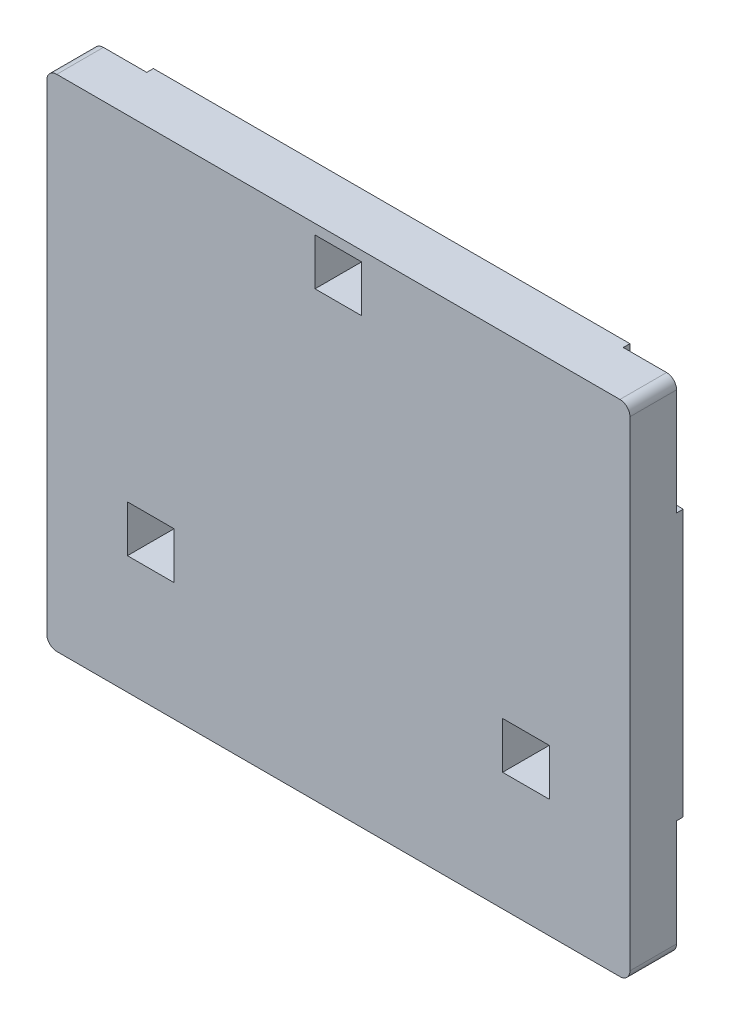
ISO-10303-21;
HEADER;
FILE_DESCRIPTION(('STEP AP214'),'2;1');
FILE_NAME('part.step','',(''),(''),'','','');
FILE_SCHEMA(('AUTOMOTIVE_DESIGN { 1 0 10303 214 1 1 1 1 }'));
ENDSEC;
DATA;
#1=APPLICATION_CONTEXT('core data for automotive mechanical design processes');
#2=APPLICATION_PROTOCOL_DEFINITION('international standard','automotive_design',2000,#1);
#3=PRODUCT_CONTEXT('',#1,'mechanical');
#4=PRODUCT('Part','Part','',(#3));
#5=PRODUCT_RELATED_PRODUCT_CATEGORY('part','',(#4));
#6=PRODUCT_DEFINITION_FORMATION('','',#4);
#7=PRODUCT_DEFINITION_CONTEXT('part definition',#1,'design');
#8=PRODUCT_DEFINITION('design','',#6,#7);
#9=PRODUCT_DEFINITION_SHAPE('','',#8);
#10=(LENGTH_UNIT() NAMED_UNIT(*) SI_UNIT(.MILLI.,.METRE.));
#11=(NAMED_UNIT(*) PLANE_ANGLE_UNIT() SI_UNIT($,.RADIAN.));
#12=(NAMED_UNIT(*) SI_UNIT($,.STERADIAN.) SOLID_ANGLE_UNIT());
#13=UNCERTAINTY_MEASURE_WITH_UNIT(LENGTH_MEASURE(1.E-05),#10,'distance_accuracy_value','');
#14=(GEOMETRIC_REPRESENTATION_CONTEXT(3) GLOBAL_UNCERTAINTY_ASSIGNED_CONTEXT((#13)) GLOBAL_UNIT_ASSIGNED_CONTEXT((#10,
#11,#12)) REPRESENTATION_CONTEXT('',''));
#15=CARTESIAN_POINT('',(0.,0.,0.));
#16=DIRECTION('',(0.,0.,1.));
#17=DIRECTION('',(1.,0.,0.));
#18=AXIS2_PLACEMENT_3D('',#15,#16,#17);
#19=CARTESIAN_POINT('',(0.,0.,16.));
#20=DIRECTION('',(-1.,0.,0.));
#21=DIRECTION('',(0.,-1.,0.));
#22=AXIS2_PLACEMENT_3D('',#19,#20,#21);
#23=PLANE('',#22);
#24=DIRECTION('',(0.,-1.,0.));
#25=VECTOR('',#24,1.);
#26=CARTESIAN_POINT('',(0.,0.,2.));
#27=LINE('',#26,#25);
#28=CARTESIAN_POINT('',(0.,-3.,2.));
#29=VERTEX_POINT('',#28);
#30=CARTESIAN_POINT('',(0.,-35.,2.));
#31=VERTEX_POINT('',#30);
#32=EDGE_CURVE('E295',#29,#31,#27,.T.);
#33=ORIENTED_EDGE('',*,*,#32,.F.);
#34=DIRECTION('',(0.,0.,-1.));
#35=VECTOR('',#34,1.);
#36=CARTESIAN_POINT('',(0.,-3.,16.));
#37=LINE('',#36,#35);
#38=CARTESIAN_POINT('',(0.,-3.,16.));
#39=VERTEX_POINT('',#38);
#40=EDGE_CURVE('E467',#29,#39,#37,.F.);
#41=ORIENTED_EDGE('',*,*,#40,.T.);
#42=DIRECTION('',(0.,1.,0.));
#43=VECTOR('',#42,1.);
#44=CARTESIAN_POINT('',(0.,0.,16.));
#45=LINE('',#44,#43);
#46=CARTESIAN_POINT('',(0.,-147.,16.));
#47=VERTEX_POINT('',#46);
#48=EDGE_CURVE('E436',#47,#39,#45,.T.);
#49=ORIENTED_EDGE('',*,*,#48,.F.);
#50=DIRECTION('',(0.,0.,-1.));
#51=VECTOR('',#50,1.);
#52=CARTESIAN_POINT('',(0.,-147.,16.));
#53=LINE('',#52,#51);
#54=CARTESIAN_POINT('',(0.,-147.,2.));
#55=VERTEX_POINT('',#54);
#56=EDGE_CURVE('E464',#47,#55,#53,.T.);
#57=ORIENTED_EDGE('',*,*,#56,.T.);
#58=DIRECTION('',(0.,-1.,0.));
#59=VECTOR('',#58,1.);
#60=CARTESIAN_POINT('',(0.,-150.,2.));
#61=LINE('',#60,#59);
#62=CARTESIAN_POINT('',(0.,-115.,2.));
#63=VERTEX_POINT('',#62);
#64=EDGE_CURVE('E270',#63,#55,#61,.T.);
#65=ORIENTED_EDGE('',*,*,#64,.F.);
#66=DIRECTION('',(0.,0.,-1.));
#67=VECTOR('',#66,1.);
#68=CARTESIAN_POINT('',(0.,-115.,2.));
#69=LINE('',#68,#67);
#70=CARTESIAN_POINT('',(0.,-115.,0.));
#71=VERTEX_POINT('',#70);
#72=EDGE_CURVE('E288',#63,#71,#69,.T.);
#73=ORIENTED_EDGE('',*,*,#72,.T.);
#74=DIRECTION('',(0.,1.,0.));
#75=VECTOR('',#74,1.);
#76=CARTESIAN_POINT('',(0.,0.,0.));
#77=LINE('',#76,#75);
#78=CARTESIAN_POINT('',(0.,-35.,0.));
#79=VERTEX_POINT('',#78);
#80=EDGE_CURVE('E367',#71,#79,#77,.T.);
#81=ORIENTED_EDGE('',*,*,#80,.T.);
#82=DIRECTION('',(0.,0.,-1.));
#83=VECTOR('',#82,1.);
#84=CARTESIAN_POINT('',(0.,-35.,2.));
#85=LINE('',#84,#83);
#86=EDGE_CURVE('E307',#31,#79,#85,.T.);
#87=ORIENTED_EDGE('',*,*,#86,.F.);
#88=EDGE_LOOP('',(#33,#41,#49,#57,#65,#73,#81,#87));
#89=FACE_BOUND('',#88,.T.);
#90=ADVANCED_FACE('F33',(#89),#23,.F.);
#91=CARTESIAN_POINT('',(0.,0.,16.));
#92=DIRECTION('',(0.,-1.,0.));
#93=DIRECTION('',(1.,0.,0.));
#94=AXIS2_PLACEMENT_3D('',#91,#92,#93);
#95=PLANE('',#94);
#96=DIRECTION('',(-1.,0.,0.));
#97=VECTOR('',#96,1.);
#98=CARTESIAN_POINT('',(0.,0.,16.));
#99=LINE('',#98,#97);
#100=CARTESIAN_POINT('',(-3.,0.,16.));
#101=VERTEX_POINT('',#100);
#102=CARTESIAN_POINT('',(-172.,0.,16.));
#103=VERTEX_POINT('',#102);
#104=EDGE_CURVE('E439',#101,#103,#99,.T.);
#105=ORIENTED_EDGE('',*,*,#104,.F.);
#106=DIRECTION('',(0.,0.,-1.));
#107=VECTOR('',#106,1.);
#108=CARTESIAN_POINT('',(-3.,0.,16.));
#109=LINE('',#108,#107);
#110=CARTESIAN_POINT('',(-3.,0.,2.));
#111=VERTEX_POINT('',#110);
#112=EDGE_CURVE('E459',#101,#111,#109,.T.);
#113=ORIENTED_EDGE('',*,*,#112,.T.);
#114=DIRECTION('',(1.,0.,0.));
#115=VECTOR('',#114,1.);
#116=CARTESIAN_POINT('',(0.,0.,2.));
#117=LINE('',#116,#115);
#118=CARTESIAN_POINT('',(-16.,0.,2.));
#119=VERTEX_POINT('',#118);
#120=EDGE_CURVE('E304',#119,#111,#117,.T.);
#121=ORIENTED_EDGE('',*,*,#120,.F.);
#122=DIRECTION('',(0.,0.,-1.));
#123=VECTOR('',#122,1.);
#124=CARTESIAN_POINT('',(-16.,0.,2.));
#125=LINE('',#124,#123);
#126=CARTESIAN_POINT('',(-16.,0.,0.));
#127=VERTEX_POINT('',#126);
#128=EDGE_CURVE('E286',#119,#127,#125,.T.);
#129=ORIENTED_EDGE('',*,*,#128,.T.);
#130=DIRECTION('',(-1.,0.,0.));
#131=VECTOR('',#130,1.);
#132=CARTESIAN_POINT('',(0.,0.,0.));
#133=LINE('',#132,#131);
#134=CARTESIAN_POINT('',(-159.,0.,0.));
#135=VERTEX_POINT('',#134);
#136=EDGE_CURVE('E452',#127,#135,#133,.T.);
#137=ORIENTED_EDGE('',*,*,#136,.T.);
#138=DIRECTION('',(0.,0.,-1.));
#139=VECTOR('',#138,1.);
#140=CARTESIAN_POINT('',(-159.,0.,2.));
#141=LINE('',#140,#139);
#142=CARTESIAN_POINT('',(-159.,0.,2.));
#143=VERTEX_POINT('',#142);
#144=EDGE_CURVE('E329',#143,#135,#141,.T.);
#145=ORIENTED_EDGE('',*,*,#144,.F.);
#146=DIRECTION('',(1.,0.,0.));
#147=VECTOR('',#146,1.);
#148=CARTESIAN_POINT('',(-175.,0.,2.));
#149=LINE('',#148,#147);
#150=CARTESIAN_POINT('',(-172.,0.,2.));
#151=VERTEX_POINT('',#150);
#152=EDGE_CURVE('E320',#151,#143,#149,.T.);
#153=ORIENTED_EDGE('',*,*,#152,.F.);
#154=DIRECTION('',(0.,0.,-1.));
#155=VECTOR('',#154,1.);
#156=CARTESIAN_POINT('',(-172.,0.,16.));
#157=LINE('',#156,#155);
#158=EDGE_CURVE('E449',#151,#103,#157,.F.);
#159=ORIENTED_EDGE('',*,*,#158,.T.);
#160=EDGE_LOOP('',(#105,#113,#121,#129,#137,#145,#153,#159));
#161=FACE_BOUND('',#160,.T.);
#162=ADVANCED_FACE('F534',(#161),#95,.F.);
#163=CARTESIAN_POINT('',(-175.,0.,16.));
#164=DIRECTION('',(1.,0.,0.));
#165=DIRECTION('',(0.,1.,0.));
#166=AXIS2_PLACEMENT_3D('',#163,#164,#165);
#167=PLANE('',#166);
#168=DIRECTION('',(0.,1.,0.));
#169=VECTOR('',#168,1.);
#170=CARTESIAN_POINT('',(-175.,-150.,2.));
#171=LINE('',#170,#169);
#172=CARTESIAN_POINT('',(-175.,-147.,2.));
#173=VERTEX_POINT('',#172);
#174=CARTESIAN_POINT('',(-175.,-115.,2.));
#175=VERTEX_POINT('',#174);
#176=EDGE_CURVE('E239',#173,#175,#171,.T.);
#177=ORIENTED_EDGE('',*,*,#176,.F.);
#178=DIRECTION('',(0.,0.,-1.));
#179=VECTOR('',#178,1.);
#180=CARTESIAN_POINT('',(-175.,-147.,16.));
#181=LINE('',#180,#179);
#182=CARTESIAN_POINT('',(-175.,-147.,16.));
#183=VERTEX_POINT('',#182);
#184=EDGE_CURVE('E41',#173,#183,#181,.F.);
#185=ORIENTED_EDGE('',*,*,#184,.T.);
#186=DIRECTION('',(0.,-1.,0.));
#187=VECTOR('',#186,1.);
#188=CARTESIAN_POINT('',(-175.,0.,16.));
#189=LINE('',#188,#187);
#190=CARTESIAN_POINT('',(-175.,-3.00000000000002,16.));
#191=VERTEX_POINT('',#190);
#192=EDGE_CURVE('E443',#191,#183,#189,.T.);
#193=ORIENTED_EDGE('',*,*,#192,.F.);
#194=DIRECTION('',(0.,0.,-1.));
#195=VECTOR('',#194,1.);
#196=CARTESIAN_POINT('',(-175.,-3.00000000000002,16.));
#197=LINE('',#196,#195);
#198=CARTESIAN_POINT('',(-175.,-3.00000000000002,2.));
#199=VERTEX_POINT('',#198);
#200=EDGE_CURVE('E485',#191,#199,#197,.T.);
#201=ORIENTED_EDGE('',*,*,#200,.T.);
#202=DIRECTION('',(0.,1.,0.));
#203=VECTOR('',#202,1.);
#204=CARTESIAN_POINT('',(-175.,0.,2.));
#205=LINE('',#204,#203);
#206=CARTESIAN_POINT('',(-175.,-34.9999999999999,2.));
#207=VERTEX_POINT('',#206);
#208=EDGE_CURVE('E317',#207,#199,#205,.T.);
#209=ORIENTED_EDGE('',*,*,#208,.F.);
#210=DIRECTION('',(0.,0.,-1.));
#211=VECTOR('',#210,1.);
#212=CARTESIAN_POINT('',(-175.,-34.9999999999999,2.));
#213=LINE('',#212,#211);
#214=CARTESIAN_POINT('',(-175.,-34.9999999999999,0.));
#215=VERTEX_POINT('',#214);
#216=EDGE_CURVE('E334',#207,#215,#213,.T.);
#217=ORIENTED_EDGE('',*,*,#216,.T.);
#218=DIRECTION('',(0.,-1.,0.));
#219=VECTOR('',#218,1.);
#220=CARTESIAN_POINT('',(-175.,0.,0.));
#221=LINE('',#220,#219);
#222=CARTESIAN_POINT('',(-175.,-115.,0.));
#223=VERTEX_POINT('',#222);
#224=EDGE_CURVE('E262',#215,#223,#221,.T.);
#225=ORIENTED_EDGE('',*,*,#224,.T.);
#226=DIRECTION('',(0.,0.,-1.));
#227=VECTOR('',#226,1.);
#228=CARTESIAN_POINT('',(-175.,-115.,2.));
#229=LINE('',#228,#227);
#230=EDGE_CURVE('E252',#175,#223,#229,.T.);
#231=ORIENTED_EDGE('',*,*,#230,.F.);
#232=EDGE_LOOP('',(#177,#185,#193,#201,#209,#217,#225,#231));
#233=FACE_BOUND('',#232,.T.);
#234=ADVANCED_FACE('F259',(#233),#167,.F.);
#235=CARTESIAN_POINT('',(0.,-150.,16.));
#236=DIRECTION('',(0.,1.,0.));
#237=DIRECTION('',(-1.,0.,0.));
#238=AXIS2_PLACEMENT_3D('',#235,#236,#237);
#239=PLANE('',#238);
#240=DIRECTION('',(-1.,0.,0.));
#241=VECTOR('',#240,1.);
#242=CARTESIAN_POINT('',(0.,-150.,2.));
#243=LINE('',#242,#241);
#244=CARTESIAN_POINT('',(-2.99999999999998,-150.,2.));
#245=VERTEX_POINT('',#244);
#246=CARTESIAN_POINT('',(-16.,-150.,2.));
#247=VERTEX_POINT('',#246);
#248=EDGE_CURVE('E273',#245,#247,#243,.T.);
#249=ORIENTED_EDGE('',*,*,#248,.F.);
#250=DIRECTION('',(0.,0.,-1.));
#251=VECTOR('',#250,1.);
#252=CARTESIAN_POINT('',(-2.99999999999998,-150.,16.));
#253=LINE('',#252,#251);
#254=CARTESIAN_POINT('',(-2.99999999999998,-150.,16.));
#255=VERTEX_POINT('',#254);
#256=EDGE_CURVE('E482',#245,#255,#253,.F.);
#257=ORIENTED_EDGE('',*,*,#256,.T.);
#258=DIRECTION('',(1.,0.,0.));
#259=VECTOR('',#258,1.);
#260=CARTESIAN_POINT('',(0.,-150.,16.));
#261=LINE('',#260,#259);
#262=CARTESIAN_POINT('',(-172.,-150.,16.));
#263=VERTEX_POINT('',#262);
#264=EDGE_CURVE('E446',#263,#255,#261,.T.);
#265=ORIENTED_EDGE('',*,*,#264,.F.);
#266=DIRECTION('',(0.,0.,-1.));
#267=VECTOR('',#266,1.);
#268=CARTESIAN_POINT('',(-172.,-150.,16.));
#269=LINE('',#268,#267);
#270=CARTESIAN_POINT('',(-172.,-150.,2.));
#271=VERTEX_POINT('',#270);
#272=EDGE_CURVE('E479',#263,#271,#269,.T.);
#273=ORIENTED_EDGE('',*,*,#272,.T.);
#274=DIRECTION('',(-1.,0.,0.));
#275=VECTOR('',#274,1.);
#276=CARTESIAN_POINT('',(-175.,-150.,2.));
#277=LINE('',#276,#275);
#278=CARTESIAN_POINT('',(-159.,-150.,2.));
#279=VERTEX_POINT('',#278);
#280=EDGE_CURVE('E263',#279,#271,#277,.T.);
#281=ORIENTED_EDGE('',*,*,#280,.F.);
#282=DIRECTION('',(0.,0.,-1.));
#283=VECTOR('',#282,1.);
#284=CARTESIAN_POINT('',(-159.,-150.,2.));
#285=LINE('',#284,#283);
#286=CARTESIAN_POINT('',(-159.,-150.,0.));
#287=VERTEX_POINT('',#286);
#288=EDGE_CURVE('E265',#279,#287,#285,.T.);
#289=ORIENTED_EDGE('',*,*,#288,.T.);
#290=DIRECTION('',(1.,0.,0.));
#291=VECTOR('',#290,1.);
#292=CARTESIAN_POINT('',(0.,-150.,0.));
#293=LINE('',#292,#291);
#294=CARTESIAN_POINT('',(-16.,-150.,0.));
#295=VERTEX_POINT('',#294);
#296=EDGE_CURVE('E440',#287,#295,#293,.T.);
#297=ORIENTED_EDGE('',*,*,#296,.T.);
#298=DIRECTION('',(0.,0.,-1.));
#299=VECTOR('',#298,1.);
#300=CARTESIAN_POINT('',(-16.,-150.,2.));
#301=LINE('',#300,#299);
#302=EDGE_CURVE('E282',#247,#295,#301,.T.);
#303=ORIENTED_EDGE('',*,*,#302,.F.);
#304=EDGE_LOOP('',(#249,#257,#265,#273,#281,#289,#297,#303));
#305=FACE_BOUND('',#304,.T.);
#306=ADVANCED_FACE('F498',(#305),#239,.F.);
#307=CARTESIAN_POINT('',(0.,0.,16.));
#308=DIRECTION('',(0.,0.,-1.));
#309=DIRECTION('',(-1.,0.,0.));
#310=AXIS2_PLACEMENT_3D('',#307,#308,#309);
#311=PLANE('',#310);
#312=DIRECTION('',(1.,0.,0.));
#313=VECTOR('',#312,1.);
#314=CARTESIAN_POINT('',(-80.5,-17.,16.));
#315=LINE('',#314,#313);
#316=CARTESIAN_POINT('',(-94.5,-17.,16.));
#317=VERTEX_POINT('',#316);
#318=CARTESIAN_POINT('',(-80.5,-17.,16.));
#319=VERTEX_POINT('',#318);
#320=EDGE_CURVE('E356',#317,#319,#315,.T.);
#321=ORIENTED_EDGE('',*,*,#320,.F.);
#322=DIRECTION('',(0.,-1.,0.));
#323=VECTOR('',#322,1.);
#324=CARTESIAN_POINT('',(-94.5,-3.00000000000004,16.));
#325=LINE('',#324,#323);
#326=CARTESIAN_POINT('',(-94.5,-3.00000000000004,16.));
#327=VERTEX_POINT('',#326);
#328=EDGE_CURVE('E354',#327,#317,#325,.T.);
#329=ORIENTED_EDGE('',*,*,#328,.F.);
#330=DIRECTION('',(-1.,0.,0.));
#331=VECTOR('',#330,1.);
#332=CARTESIAN_POINT('',(-80.5,-3.00000000000003,16.));
#333=LINE('',#332,#331);
#334=CARTESIAN_POINT('',(-80.5,-3.00000000000003,16.));
#335=VERTEX_POINT('',#334);
#336=EDGE_CURVE('E344',#335,#327,#333,.T.);
#337=ORIENTED_EDGE('',*,*,#336,.F.);
#338=DIRECTION('',(0.,1.,0.));
#339=VECTOR('',#338,1.);
#340=CARTESIAN_POINT('',(-80.5,-3.00000000000003,16.));
#341=LINE('',#340,#339);
#342=EDGE_CURVE('E360',#319,#335,#341,.T.);
#343=ORIENTED_EDGE('',*,*,#342,.F.);
#344=EDGE_LOOP('',(#321,#329,#337,#343));
#345=FACE_BOUND('',#344,.T.);
#346=DIRECTION('',(1.,0.,0.));
#347=VECTOR('',#346,1.);
#348=CARTESIAN_POINT('',(-136.791651245988,-114.5,16.));
#349=LINE('',#348,#347);
#350=CARTESIAN_POINT('',(-150.791651245988,-114.5,16.));
#351=VERTEX_POINT('',#350);
#352=CARTESIAN_POINT('',(-136.791651245988,-114.5,16.));
#353=VERTEX_POINT('',#352);
#354=EDGE_CURVE('E390',#351,#353,#349,.T.);
#355=ORIENTED_EDGE('',*,*,#354,.F.);
#356=DIRECTION('',(0.,-1.,0.));
#357=VECTOR('',#356,1.);
#358=CARTESIAN_POINT('',(-150.791651245988,-114.5,16.));
#359=LINE('',#358,#357);
#360=CARTESIAN_POINT('',(-150.791651245988,-100.5,16.));
#361=VERTEX_POINT('',#360);
#362=EDGE_CURVE('E388',#361,#351,#359,.T.);
#363=ORIENTED_EDGE('',*,*,#362,.F.);
#364=DIRECTION('',(-1.,0.,0.));
#365=VECTOR('',#364,1.);
#366=CARTESIAN_POINT('',(-136.791651245988,-100.5,16.));
#367=LINE('',#366,#365);
#368=CARTESIAN_POINT('',(-136.791651245988,-100.5,16.));
#369=VERTEX_POINT('',#368);
#370=EDGE_CURVE('E378',#369,#361,#367,.T.);
#371=ORIENTED_EDGE('',*,*,#370,.F.);
#372=DIRECTION('',(0.,1.,0.));
#373=VECTOR('',#372,1.);
#374=CARTESIAN_POINT('',(-136.791651245988,-114.5,16.));
#375=LINE('',#374,#373);
#376=EDGE_CURVE('E394',#353,#369,#375,.T.);
#377=ORIENTED_EDGE('',*,*,#376,.F.);
#378=EDGE_LOOP('',(#355,#363,#371,#377));
#379=FACE_BOUND('',#378,.T.);
#380=DIRECTION('',(1.,0.,0.));
#381=VECTOR('',#380,1.);
#382=CARTESIAN_POINT('',(-24.2083487540115,-114.5,16.));
#383=LINE('',#382,#381);
#384=CARTESIAN_POINT('',(-38.2083487540115,-114.5,16.));
#385=VERTEX_POINT('',#384);
#386=CARTESIAN_POINT('',(-24.2083487540115,-114.5,16.));
#387=VERTEX_POINT('',#386);
#388=EDGE_CURVE('E421',#385,#387,#383,.T.);
#389=ORIENTED_EDGE('',*,*,#388,.F.);
#390=DIRECTION('',(0.,-1.,0.));
#391=VECTOR('',#390,1.);
#392=CARTESIAN_POINT('',(-38.2083487540115,-114.5,16.));
#393=LINE('',#392,#391);
#394=CARTESIAN_POINT('',(-38.2083487540115,-100.5,16.));
#395=VERTEX_POINT('',#394);
#396=EDGE_CURVE('E336',#395,#385,#393,.T.);
#397=ORIENTED_EDGE('',*,*,#396,.F.);
#398=DIRECTION('',(-1.,0.,0.));
#399=VECTOR('',#398,1.);
#400=CARTESIAN_POINT('',(-24.2083487540115,-100.5,16.));
#401=LINE('',#400,#399);
#402=CARTESIAN_POINT('',(-24.2083487540115,-100.5,16.));
#403=VERTEX_POINT('',#402);
#404=EDGE_CURVE('E410',#403,#395,#401,.T.);
#405=ORIENTED_EDGE('',*,*,#404,.F.);
#406=DIRECTION('',(0.,1.,0.));
#407=VECTOR('',#406,1.);
#408=CARTESIAN_POINT('',(-24.2083487540115,-114.5,16.));
#409=LINE('',#408,#407);
#410=EDGE_CURVE('E424',#387,#403,#409,.T.);
#411=ORIENTED_EDGE('',*,*,#410,.F.);
#412=EDGE_LOOP('',(#389,#397,#405,#411));
#413=FACE_BOUND('',#412,.T.);
#414=ORIENTED_EDGE('',*,*,#48,.T.);
#415=CARTESIAN_POINT('',(-3.,-3.,16.));
#416=DIRECTION('',(0.,0.,-1.));
#417=DIRECTION('',(-1.,0.,0.));
#418=AXIS2_PLACEMENT_3D('',#415,#416,#417);
#419=CIRCLE('',#418,3.);
#420=EDGE_CURVE('E475',#39,#101,#419,.F.);
#421=ORIENTED_EDGE('',*,*,#420,.T.);
#422=ORIENTED_EDGE('',*,*,#104,.T.);
#423=CARTESIAN_POINT('',(-172.,-3.00000000000002,16.));
#424=DIRECTION('',(0.,0.,-1.));
#425=DIRECTION('',(-1.,0.,0.));
#426=AXIS2_PLACEMENT_3D('',#423,#424,#425);
#427=CIRCLE('',#426,3.);
#428=EDGE_CURVE('E469',#103,#191,#427,.F.);
#429=ORIENTED_EDGE('',*,*,#428,.T.);
#430=ORIENTED_EDGE('',*,*,#192,.T.);
#431=CARTESIAN_POINT('',(-172.,-147.,16.));
#432=DIRECTION('',(0.,0.,-1.));
#433=DIRECTION('',(-1.,0.,0.));
#434=AXIS2_PLACEMENT_3D('',#431,#432,#433);
#435=CIRCLE('',#434,3.);
#436=EDGE_CURVE('E471',#183,#263,#435,.F.);
#437=ORIENTED_EDGE('',*,*,#436,.T.);
#438=ORIENTED_EDGE('',*,*,#264,.T.);
#439=CARTESIAN_POINT('',(-2.99999999999998,-147.,16.));
#440=DIRECTION('',(0.,0.,-1.));
#441=DIRECTION('',(-1.,0.,0.));
#442=AXIS2_PLACEMENT_3D('',#439,#440,#441);
#443=CIRCLE('',#442,3.);
#444=EDGE_CURVE('E473',#255,#47,#443,.F.);
#445=ORIENTED_EDGE('',*,*,#444,.T.);
#446=EDGE_LOOP('',(#414,#421,#422,#429,#430,#437,#438,#445));
#447=FACE_BOUND('',#446,.T.);
#448=ADVANCED_FACE('F490',(#345,#379,#413,#447),#311,.F.);
#449=CARTESIAN_POINT('',(0.,0.,0.));
#450=DIRECTION('',(0.,0.,-1.));
#451=DIRECTION('',(-1.,0.,0.));
#452=AXIS2_PLACEMENT_3D('',#449,#450,#451);
#453=PLANE('',#452);
#454=DIRECTION('',(0.,1.,0.));
#455=VECTOR('',#454,1.);
#456=CARTESIAN_POINT('',(-16.,0.,0.));
#457=LINE('',#456,#455);
#458=CARTESIAN_POINT('',(-16.,-35.,0.));
#459=VERTEX_POINT('',#458);
#460=EDGE_CURVE('E298',#459,#127,#457,.T.);
#461=ORIENTED_EDGE('',*,*,#460,.F.);
#462=DIRECTION('',(-1.,0.,0.));
#463=VECTOR('',#462,1.);
#464=CARTESIAN_POINT('',(0.,-35.,0.));
#465=LINE('',#464,#463);
#466=EDGE_CURVE('E308',#79,#459,#465,.T.);
#467=ORIENTED_EDGE('',*,*,#466,.F.);
#468=ORIENTED_EDGE('',*,*,#80,.F.);
#469=DIRECTION('',(1.,0.,0.));
#470=VECTOR('',#469,1.);
#471=CARTESIAN_POINT('',(0.,-115.,0.));
#472=LINE('',#471,#470);
#473=CARTESIAN_POINT('',(-16.,-115.,0.));
#474=VERTEX_POINT('',#473);
#475=EDGE_CURVE('E274',#474,#71,#472,.T.);
#476=ORIENTED_EDGE('',*,*,#475,.F.);
#477=DIRECTION('',(0.,1.,0.));
#478=VECTOR('',#477,1.);
#479=CARTESIAN_POINT('',(-16.,-150.,0.));
#480=LINE('',#479,#478);
#481=EDGE_CURVE('E283',#295,#474,#480,.T.);
#482=ORIENTED_EDGE('',*,*,#481,.F.);
#483=ORIENTED_EDGE('',*,*,#296,.F.);
#484=DIRECTION('',(0.,-1.,0.));
#485=VECTOR('',#484,1.);
#486=CARTESIAN_POINT('',(-159.,-150.,0.));
#487=LINE('',#486,#485);
#488=CARTESIAN_POINT('',(-159.,-115.,0.));
#489=VERTEX_POINT('',#488);
#490=EDGE_CURVE('E247',#489,#287,#487,.T.);
#491=ORIENTED_EDGE('',*,*,#490,.F.);
#492=DIRECTION('',(1.,0.,0.));
#493=VECTOR('',#492,1.);
#494=CARTESIAN_POINT('',(-175.,-115.,0.));
#495=LINE('',#494,#493);
#496=EDGE_CURVE('E291',#223,#489,#495,.T.);
#497=ORIENTED_EDGE('',*,*,#496,.F.);
#498=ORIENTED_EDGE('',*,*,#224,.F.);
#499=DIRECTION('',(-1.,0.,0.));
#500=VECTOR('',#499,1.);
#501=CARTESIAN_POINT('',(-175.,-34.9999999999999,0.));
#502=LINE('',#501,#500);
#503=CARTESIAN_POINT('',(-159.,-34.9999999999999,0.));
#504=VERTEX_POINT('',#503);
#505=EDGE_CURVE('E321',#504,#215,#502,.T.);
#506=ORIENTED_EDGE('',*,*,#505,.F.);
#507=DIRECTION('',(0.,-1.,0.));
#508=VECTOR('',#507,1.);
#509=CARTESIAN_POINT('',(-159.,0.,0.));
#510=LINE('',#509,#508);
#511=EDGE_CURVE('E330',#135,#504,#510,.T.);
#512=ORIENTED_EDGE('',*,*,#511,.F.);
#513=ORIENTED_EDGE('',*,*,#136,.F.);
#514=EDGE_LOOP('',(#461,#467,#468,#476,#482,#483,#491,#497,#498,#506,#512,#513));
#515=FACE_BOUND('',#514,.T.);
#516=ADVANCED_FACE('F510',(#515),#453,.T.);
#517=CARTESIAN_POINT('',(-38.2083487540115,-114.5,2.));
#518=DIRECTION('',(-1.,0.,0.));
#519=DIRECTION('',(0.,0.,1.));
#520=AXIS2_PLACEMENT_3D('',#517,#518,#519);
#521=PLANE('',#520);
#522=ORIENTED_EDGE('',*,*,#396,.T.);
#523=DIRECTION('',(0.,0.,1.));
#524=VECTOR('',#523,1.);
#525=CARTESIAN_POINT('',(-38.2083487540115,-114.5,2.));
#526=LINE('',#525,#524);
#527=CARTESIAN_POINT('',(-38.2083487540115,-114.5,2.));
#528=VERTEX_POINT('',#527);
#529=EDGE_CURVE('E419',#528,#385,#526,.T.);
#530=ORIENTED_EDGE('',*,*,#529,.F.);
#531=DIRECTION('',(0.,-1.,0.));
#532=VECTOR('',#531,1.);
#533=CARTESIAN_POINT('',(-38.2083487540115,-114.5,2.));
#534=LINE('',#533,#532);
#535=CARTESIAN_POINT('',(-38.2083487540115,-100.5,2.));
#536=VERTEX_POINT('',#535);
#537=EDGE_CURVE('E406',#536,#528,#534,.T.);
#538=ORIENTED_EDGE('',*,*,#537,.F.);
#539=DIRECTION('',(0.,0.,1.));
#540=VECTOR('',#539,1.);
#541=CARTESIAN_POINT('',(-38.2083487540115,-100.5,2.));
#542=LINE('',#541,#540);
#543=EDGE_CURVE('E391',#536,#395,#542,.T.);
#544=ORIENTED_EDGE('',*,*,#543,.T.);
#545=EDGE_LOOP('',(#522,#530,#538,#544));
#546=FACE_BOUND('',#545,.T.);
#547=ADVANCED_FACE('F739',(#546),#521,.F.);
#548=CARTESIAN_POINT('',(-24.2083487540115,-100.5,2.));
#549=DIRECTION('',(0.,1.,0.));
#550=DIRECTION('',(0.,0.,1.));
#551=AXIS2_PLACEMENT_3D('',#548,#549,#550);
#552=PLANE('',#551);
#553=ORIENTED_EDGE('',*,*,#404,.T.);
#554=ORIENTED_EDGE('',*,*,#543,.F.);
#555=DIRECTION('',(-1.,0.,0.));
#556=VECTOR('',#555,1.);
#557=CARTESIAN_POINT('',(-24.2083487540115,-100.5,2.));
#558=LINE('',#557,#556);
#559=CARTESIAN_POINT('',(-24.2083487540115,-100.5,2.));
#560=VERTEX_POINT('',#559);
#561=EDGE_CURVE('E416',#560,#536,#558,.T.);
#562=ORIENTED_EDGE('',*,*,#561,.F.);
#563=DIRECTION('',(0.,0.,1.));
#564=VECTOR('',#563,1.);
#565=CARTESIAN_POINT('',(-24.2083487540115,-100.5,2.));
#566=LINE('',#565,#564);
#567=EDGE_CURVE('E430',#560,#403,#566,.T.);
#568=ORIENTED_EDGE('',*,*,#567,.T.);
#569=EDGE_LOOP('',(#553,#554,#562,#568));
#570=FACE_BOUND('',#569,.T.);
#571=ADVANCED_FACE('F868',(#570),#552,.F.);
#572=CARTESIAN_POINT('',(-24.2083487540115,-114.5,2.));
#573=DIRECTION('',(1.,0.,0.));
#574=DIRECTION('',(0.,0.,-1.));
#575=AXIS2_PLACEMENT_3D('',#572,#573,#574);
#576=PLANE('',#575);
#577=ORIENTED_EDGE('',*,*,#410,.T.);
#578=ORIENTED_EDGE('',*,*,#567,.F.);
#579=DIRECTION('',(0.,1.,0.));
#580=VECTOR('',#579,1.);
#581=CARTESIAN_POINT('',(-24.2083487540115,-114.5,2.));
#582=LINE('',#581,#580);
#583=CARTESIAN_POINT('',(-24.2083487540115,-114.5,2.));
#584=VERTEX_POINT('',#583);
#585=EDGE_CURVE('E413',#584,#560,#582,.T.);
#586=ORIENTED_EDGE('',*,*,#585,.F.);
#587=DIRECTION('',(0.,0.,1.));
#588=VECTOR('',#587,1.);
#589=CARTESIAN_POINT('',(-24.2083487540115,-114.5,2.));
#590=LINE('',#589,#588);
#591=EDGE_CURVE('E432',#584,#387,#590,.T.);
#592=ORIENTED_EDGE('',*,*,#591,.T.);
#593=EDGE_LOOP('',(#577,#578,#586,#592));
#594=FACE_BOUND('',#593,.T.);
#595=ADVANCED_FACE('F858',(#594),#576,.F.);
#596=CARTESIAN_POINT('',(-24.2083487540115,-114.5,2.));
#597=DIRECTION('',(0.,-1.,0.));
#598=DIRECTION('',(0.,0.,-1.));
#599=AXIS2_PLACEMENT_3D('',#596,#597,#598);
#600=PLANE('',#599);
#601=ORIENTED_EDGE('',*,*,#388,.T.);
#602=ORIENTED_EDGE('',*,*,#591,.F.);
#603=DIRECTION('',(1.,0.,0.));
#604=VECTOR('',#603,1.);
#605=CARTESIAN_POINT('',(-24.2083487540115,-114.5,2.));
#606=LINE('',#605,#604);
#607=EDGE_CURVE('E409',#528,#584,#606,.T.);
#608=ORIENTED_EDGE('',*,*,#607,.F.);
#609=ORIENTED_EDGE('',*,*,#529,.T.);
#610=EDGE_LOOP('',(#601,#602,#608,#609));
#611=FACE_BOUND('',#610,.T.);
#612=ADVANCED_FACE('F848',(#611),#600,.F.);
#613=CARTESIAN_POINT('',(0.,0.,2.));
#614=DIRECTION('',(0.,0.,1.));
#615=DIRECTION('',(1.,0.,0.));
#616=AXIS2_PLACEMENT_3D('',#613,#614,#615);
#617=PLANE('',#616);
#618=ORIENTED_EDGE('',*,*,#537,.T.);
#619=ORIENTED_EDGE('',*,*,#607,.T.);
#620=ORIENTED_EDGE('',*,*,#585,.T.);
#621=ORIENTED_EDGE('',*,*,#561,.T.);
#622=EDGE_LOOP('',(#618,#619,#620,#621));
#623=FACE_BOUND('',#622,.T.);
#624=ADVANCED_FACE('F838',(#623),#617,.T.);
#625=CARTESIAN_POINT('',(-150.791651245988,-114.5,2.));
#626=DIRECTION('',(-1.,0.,0.));
#627=DIRECTION('',(0.,0.,1.));
#628=AXIS2_PLACEMENT_3D('',#625,#626,#627);
#629=PLANE('',#628);
#630=ORIENTED_EDGE('',*,*,#362,.T.);
#631=DIRECTION('',(0.,0.,1.));
#632=VECTOR('',#631,1.);
#633=CARTESIAN_POINT('',(-150.791651245988,-114.5,2.));
#634=LINE('',#633,#632);
#635=CARTESIAN_POINT('',(-150.791651245988,-114.5,2.));
#636=VERTEX_POINT('',#635);
#637=EDGE_CURVE('E387',#636,#351,#634,.T.);
#638=ORIENTED_EDGE('',*,*,#637,.F.);
#639=DIRECTION('',(0.,-1.,0.));
#640=VECTOR('',#639,1.);
#641=CARTESIAN_POINT('',(-150.791651245988,-114.5,2.));
#642=LINE('',#641,#640);
#643=CARTESIAN_POINT('',(-150.791651245988,-100.5,2.));
#644=VERTEX_POINT('',#643);
#645=EDGE_CURVE('E374',#644,#636,#642,.T.);
#646=ORIENTED_EDGE('',*,*,#645,.F.);
#647=DIRECTION('',(0.,0.,1.));
#648=VECTOR('',#647,1.);
#649=CARTESIAN_POINT('',(-150.791651245988,-100.5,2.));
#650=LINE('',#649,#648);
#651=EDGE_CURVE('E357',#644,#361,#650,.T.);
#652=ORIENTED_EDGE('',*,*,#651,.T.);
#653=EDGE_LOOP('',(#630,#638,#646,#652));
#654=FACE_BOUND('',#653,.T.);
#655=ADVANCED_FACE('F828',(#654),#629,.F.);
#656=CARTESIAN_POINT('',(-136.791651245988,-100.5,2.));
#657=DIRECTION('',(0.,1.,0.));
#658=DIRECTION('',(0.,0.,1.));
#659=AXIS2_PLACEMENT_3D('',#656,#657,#658);
#660=PLANE('',#659);
#661=ORIENTED_EDGE('',*,*,#370,.T.);
#662=ORIENTED_EDGE('',*,*,#651,.F.);
#663=DIRECTION('',(-1.,0.,0.));
#664=VECTOR('',#663,1.);
#665=CARTESIAN_POINT('',(-136.791651245988,-100.5,2.));
#666=LINE('',#665,#664);
#667=CARTESIAN_POINT('',(-136.791651245988,-100.5,2.));
#668=VERTEX_POINT('',#667);
#669=EDGE_CURVE('E384',#668,#644,#666,.T.);
#670=ORIENTED_EDGE('',*,*,#669,.F.);
#671=DIRECTION('',(0.,0.,1.));
#672=VECTOR('',#671,1.);
#673=CARTESIAN_POINT('',(-136.791651245988,-100.5,2.));
#674=LINE('',#673,#672);
#675=EDGE_CURVE('E400',#668,#369,#674,.T.);
#676=ORIENTED_EDGE('',*,*,#675,.T.);
#677=EDGE_LOOP('',(#661,#662,#670,#676));
#678=FACE_BOUND('',#677,.T.);
#679=ADVANCED_FACE('F818',(#678),#660,.F.);
#680=CARTESIAN_POINT('',(-136.791651245988,-114.5,2.));
#681=DIRECTION('',(1.,0.,0.));
#682=DIRECTION('',(0.,0.,-1.));
#683=AXIS2_PLACEMENT_3D('',#680,#681,#682);
#684=PLANE('',#683);
#685=ORIENTED_EDGE('',*,*,#376,.T.);
#686=ORIENTED_EDGE('',*,*,#675,.F.);
#687=DIRECTION('',(0.,1.,0.));
#688=VECTOR('',#687,1.);
#689=CARTESIAN_POINT('',(-136.791651245988,-114.5,2.));
#690=LINE('',#689,#688);
#691=CARTESIAN_POINT('',(-136.791651245988,-114.5,2.));
#692=VERTEX_POINT('',#691);
#693=EDGE_CURVE('E381',#692,#668,#690,.T.);
#694=ORIENTED_EDGE('',*,*,#693,.F.);
#695=DIRECTION('',(0.,0.,1.));
#696=VECTOR('',#695,1.);
#697=CARTESIAN_POINT('',(-136.791651245988,-114.5,2.));
#698=LINE('',#697,#696);
#699=EDGE_CURVE('E402',#692,#353,#698,.T.);
#700=ORIENTED_EDGE('',*,*,#699,.T.);
#701=EDGE_LOOP('',(#685,#686,#694,#700));
#702=FACE_BOUND('',#701,.T.);
#703=ADVANCED_FACE('F808',(#702),#684,.F.);
#704=CARTESIAN_POINT('',(-136.791651245988,-114.5,2.));
#705=DIRECTION('',(0.,-1.,0.));
#706=DIRECTION('',(0.,0.,-1.));
#707=AXIS2_PLACEMENT_3D('',#704,#705,#706);
#708=PLANE('',#707);
#709=ORIENTED_EDGE('',*,*,#354,.T.);
#710=ORIENTED_EDGE('',*,*,#699,.F.);
#711=DIRECTION('',(1.,0.,0.));
#712=VECTOR('',#711,1.);
#713=CARTESIAN_POINT('',(-136.791651245988,-114.5,2.));
#714=LINE('',#713,#712);
#715=EDGE_CURVE('E377',#636,#692,#714,.T.);
#716=ORIENTED_EDGE('',*,*,#715,.F.);
#717=ORIENTED_EDGE('',*,*,#637,.T.);
#718=EDGE_LOOP('',(#709,#710,#716,#717));
#719=FACE_BOUND('',#718,.T.);
#720=ADVANCED_FACE('F798',(#719),#708,.F.);
#721=CARTESIAN_POINT('',(0.,0.,2.));
#722=DIRECTION('',(0.,0.,1.));
#723=DIRECTION('',(1.,0.,0.));
#724=AXIS2_PLACEMENT_3D('',#721,#722,#723);
#725=PLANE('',#724);
#726=ORIENTED_EDGE('',*,*,#645,.T.);
#727=ORIENTED_EDGE('',*,*,#715,.T.);
#728=ORIENTED_EDGE('',*,*,#693,.T.);
#729=ORIENTED_EDGE('',*,*,#669,.T.);
#730=EDGE_LOOP('',(#726,#727,#728,#729));
#731=FACE_BOUND('',#730,.T.);
#732=ADVANCED_FACE('F788',(#731),#725,.T.);
#733=CARTESIAN_POINT('',(-94.5,-3.00000000000004,2.));
#734=DIRECTION('',(-1.,0.,0.));
#735=DIRECTION('',(0.,0.,1.));
#736=AXIS2_PLACEMENT_3D('',#733,#734,#735);
#737=PLANE('',#736);
#738=ORIENTED_EDGE('',*,*,#328,.T.);
#739=DIRECTION('',(0.,0.,1.));
#740=VECTOR('',#739,1.);
#741=CARTESIAN_POINT('',(-94.5,-17.,2.));
#742=LINE('',#741,#740);
#743=CARTESIAN_POINT('',(-94.5,-17.,2.));
#744=VERTEX_POINT('',#743);
#745=EDGE_CURVE('E353',#744,#317,#742,.T.);
#746=ORIENTED_EDGE('',*,*,#745,.F.);
#747=DIRECTION('',(0.,-1.,0.));
#748=VECTOR('',#747,1.);
#749=CARTESIAN_POINT('',(-94.5,-3.00000000000004,2.));
#750=LINE('',#749,#748);
#751=CARTESIAN_POINT('',(-94.5,-3.00000000000004,2.));
#752=VERTEX_POINT('',#751);
#753=EDGE_CURVE('E340',#752,#744,#750,.T.);
#754=ORIENTED_EDGE('',*,*,#753,.F.);
#755=DIRECTION('',(0.,0.,1.));
#756=VECTOR('',#755,1.);
#757=CARTESIAN_POINT('',(-94.5,-3.00000000000004,2.));
#758=LINE('',#757,#756);
#759=EDGE_CURVE('E365',#752,#327,#758,.T.);
#760=ORIENTED_EDGE('',*,*,#759,.T.);
#761=EDGE_LOOP('',(#738,#746,#754,#760));
#762=FACE_BOUND('',#761,.T.);
#763=ADVANCED_FACE('F778',(#762),#737,.F.);
#764=CARTESIAN_POINT('',(-80.5,-3.00000000000003,2.));
#765=DIRECTION('',(0.,1.,0.));
#766=DIRECTION('',(-1.,0.,0.));
#767=AXIS2_PLACEMENT_3D('',#764,#765,#766);
#768=PLANE('',#767);
#769=ORIENTED_EDGE('',*,*,#336,.T.);
#770=ORIENTED_EDGE('',*,*,#759,.F.);
#771=DIRECTION('',(-1.,0.,0.));
#772=VECTOR('',#771,1.);
#773=CARTESIAN_POINT('',(-80.5,-3.00000000000003,2.));
#774=LINE('',#773,#772);
#775=CARTESIAN_POINT('',(-80.5,-3.00000000000003,2.));
#776=VERTEX_POINT('',#775);
#777=EDGE_CURVE('E350',#776,#752,#774,.T.);
#778=ORIENTED_EDGE('',*,*,#777,.F.);
#779=DIRECTION('',(0.,0.,1.));
#780=VECTOR('',#779,1.);
#781=CARTESIAN_POINT('',(-80.5,-3.00000000000003,2.));
#782=LINE('',#781,#780);
#783=EDGE_CURVE('E368',#776,#335,#782,.T.);
#784=ORIENTED_EDGE('',*,*,#783,.T.);
#785=EDGE_LOOP('',(#769,#770,#778,#784));
#786=FACE_BOUND('',#785,.T.);
#787=ADVANCED_FACE('F768',(#786),#768,.F.);
#788=CARTESIAN_POINT('',(-80.5,-3.00000000000003,2.));
#789=DIRECTION('',(1.,0.,0.));
#790=DIRECTION('',(0.,0.,-1.));
#791=AXIS2_PLACEMENT_3D('',#788,#789,#790);
#792=PLANE('',#791);
#793=ORIENTED_EDGE('',*,*,#342,.T.);
#794=ORIENTED_EDGE('',*,*,#783,.F.);
#795=DIRECTION('',(0.,1.,0.));
#796=VECTOR('',#795,1.);
#797=CARTESIAN_POINT('',(-80.5,-3.00000000000003,2.));
#798=LINE('',#797,#796);
#799=CARTESIAN_POINT('',(-80.5,-17.,2.));
#800=VERTEX_POINT('',#799);
#801=EDGE_CURVE('E347',#800,#776,#798,.T.);
#802=ORIENTED_EDGE('',*,*,#801,.F.);
#803=DIRECTION('',(0.,0.,1.));
#804=VECTOR('',#803,1.);
#805=CARTESIAN_POINT('',(-80.5,-17.,2.));
#806=LINE('',#805,#804);
#807=EDGE_CURVE('E370',#800,#319,#806,.T.);
#808=ORIENTED_EDGE('',*,*,#807,.T.);
#809=EDGE_LOOP('',(#793,#794,#802,#808));
#810=FACE_BOUND('',#809,.T.);
#811=ADVANCED_FACE('F758',(#810),#792,.F.);
#812=CARTESIAN_POINT('',(-80.5,-17.,2.));
#813=DIRECTION('',(0.,-1.,0.));
#814=DIRECTION('',(0.,0.,-1.));
#815=AXIS2_PLACEMENT_3D('',#812,#813,#814);
#816=PLANE('',#815);
#817=ORIENTED_EDGE('',*,*,#320,.T.);
#818=ORIENTED_EDGE('',*,*,#807,.F.);
#819=DIRECTION('',(1.,0.,0.));
#820=VECTOR('',#819,1.);
#821=CARTESIAN_POINT('',(-80.5,-17.,2.));
#822=LINE('',#821,#820);
#823=EDGE_CURVE('E343',#744,#800,#822,.T.);
#824=ORIENTED_EDGE('',*,*,#823,.F.);
#825=ORIENTED_EDGE('',*,*,#745,.T.);
#826=EDGE_LOOP('',(#817,#818,#824,#825));
#827=FACE_BOUND('',#826,.T.);
#828=ADVANCED_FACE('F748',(#827),#816,.F.);
#829=CARTESIAN_POINT('',(0.,0.,2.));
#830=DIRECTION('',(0.,0.,-1.));
#831=DIRECTION('',(-1.,0.,0.));
#832=AXIS2_PLACEMENT_3D('',#829,#830,#831);
#833=PLANE('',#832);
#834=ORIENTED_EDGE('',*,*,#753,.T.);
#835=ORIENTED_EDGE('',*,*,#823,.T.);
#836=ORIENTED_EDGE('',*,*,#801,.T.);
#837=ORIENTED_EDGE('',*,*,#777,.T.);
#838=EDGE_LOOP('',(#834,#835,#836,#837));
#839=FACE_BOUND('',#838,.T.);
#840=ADVANCED_FACE('F730',(#839),#833,.F.);
#841=CARTESIAN_POINT('',(-175.,-34.9999999999999,2.));
#842=DIRECTION('',(0.,-1.,0.));
#843=DIRECTION('',(0.,0.,-1.));
#844=AXIS2_PLACEMENT_3D('',#841,#842,#843);
#845=PLANE('',#844);
#846=ORIENTED_EDGE('',*,*,#505,.T.);
#847=ORIENTED_EDGE('',*,*,#216,.F.);
#848=DIRECTION('',(-1.,0.,0.));
#849=VECTOR('',#848,1.);
#850=CARTESIAN_POINT('',(-175.,-34.9999999999999,2.));
#851=LINE('',#850,#849);
#852=CARTESIAN_POINT('',(-159.,-34.9999999999999,2.));
#853=VERTEX_POINT('',#852);
#854=EDGE_CURVE('E326',#853,#207,#851,.T.);
#855=ORIENTED_EDGE('',*,*,#854,.F.);
#856=DIRECTION('',(0.,0.,-1.));
#857=VECTOR('',#856,1.);
#858=CARTESIAN_POINT('',(-159.,-34.9999999999999,2.));
#859=LINE('',#858,#857);
#860=EDGE_CURVE('E337',#853,#504,#859,.T.);
#861=ORIENTED_EDGE('',*,*,#860,.T.);
#862=EDGE_LOOP('',(#846,#847,#855,#861));
#863=FACE_BOUND('',#862,.T.);
#864=ADVANCED_FACE('F544',(#863),#845,.F.);
#865=CARTESIAN_POINT('',(-159.,0.,2.));
#866=DIRECTION('',(1.,0.,0.));
#867=DIRECTION('',(0.,0.,-1.));
#868=AXIS2_PLACEMENT_3D('',#865,#866,#867);
#869=PLANE('',#868);
#870=ORIENTED_EDGE('',*,*,#511,.T.);
#871=ORIENTED_EDGE('',*,*,#860,.F.);
#872=DIRECTION('',(0.,-1.,0.));
#873=VECTOR('',#872,1.);
#874=CARTESIAN_POINT('',(-159.,0.,2.));
#875=LINE('',#874,#873);
#876=EDGE_CURVE('E323',#143,#853,#875,.T.);
#877=ORIENTED_EDGE('',*,*,#876,.F.);
#878=ORIENTED_EDGE('',*,*,#144,.T.);
#879=EDGE_LOOP('',(#870,#871,#877,#878));
#880=FACE_BOUND('',#879,.T.);
#881=ADVANCED_FACE('F643',(#880),#869,.F.);
#882=CARTESIAN_POINT('',(0.,0.,2.));
#883=DIRECTION('',(0.,0.,1.));
#884=DIRECTION('',(1.,0.,0.));
#885=AXIS2_PLACEMENT_3D('',#882,#883,#884);
#886=PLANE('',#885);
#887=ORIENTED_EDGE('',*,*,#208,.T.);
#888=CARTESIAN_POINT('',(-172.,-3.00000000000002,2.));
#889=DIRECTION('',(0.,0.,1.));
#890=DIRECTION('',(1.,0.,0.));
#891=AXIS2_PLACEMENT_3D('',#888,#889,#890);
#892=CIRCLE('',#891,3.);
#893=EDGE_CURVE('E11',#199,#151,#892,.F.);
#894=ORIENTED_EDGE('',*,*,#893,.T.);
#895=ORIENTED_EDGE('',*,*,#152,.T.);
#896=ORIENTED_EDGE('',*,*,#876,.T.);
#897=ORIENTED_EDGE('',*,*,#854,.T.);
#898=EDGE_LOOP('',(#887,#894,#895,#896,#897));
#899=FACE_BOUND('',#898,.T.);
#900=ADVANCED_FACE('F540',(#899),#886,.F.);
#901=CARTESIAN_POINT('',(-159.,-150.,2.));
#902=DIRECTION('',(1.,0.,0.));
#903=DIRECTION('',(0.,0.,-1.));
#904=AXIS2_PLACEMENT_3D('',#901,#902,#903);
#905=PLANE('',#904);
#906=ORIENTED_EDGE('',*,*,#490,.T.);
#907=ORIENTED_EDGE('',*,*,#288,.F.);
#908=DIRECTION('',(0.,-1.,0.));
#909=VECTOR('',#908,1.);
#910=CARTESIAN_POINT('',(-159.,-150.,2.));
#911=LINE('',#910,#909);
#912=CARTESIAN_POINT('',(-159.,-115.,2.));
#913=VERTEX_POINT('',#912);
#914=EDGE_CURVE('E256',#913,#279,#911,.T.);
#915=ORIENTED_EDGE('',*,*,#914,.F.);
#916=DIRECTION('',(0.,0.,-1.));
#917=VECTOR('',#916,1.);
#918=CARTESIAN_POINT('',(-159.,-115.,2.));
#919=LINE('',#918,#917);
#920=EDGE_CURVE('E254',#913,#489,#919,.T.);
#921=ORIENTED_EDGE('',*,*,#920,.T.);
#922=EDGE_LOOP('',(#906,#907,#915,#921));
#923=FACE_BOUND('',#922,.T.);
#924=ADVANCED_FACE('F642',(#923),#905,.F.);
#925=CARTESIAN_POINT('',(-175.,-115.,2.));
#926=DIRECTION('',(0.,1.,0.));
#927=DIRECTION('',(-1.,0.,0.));
#928=AXIS2_PLACEMENT_3D('',#925,#926,#927);
#929=PLANE('',#928);
#930=ORIENTED_EDGE('',*,*,#496,.T.);
#931=ORIENTED_EDGE('',*,*,#920,.F.);
#932=DIRECTION('',(1.,0.,0.));
#933=VECTOR('',#932,1.);
#934=CARTESIAN_POINT('',(-175.,-115.,2.));
#935=LINE('',#934,#933);
#936=EDGE_CURVE('E243',#175,#913,#935,.T.);
#937=ORIENTED_EDGE('',*,*,#936,.F.);
#938=ORIENTED_EDGE('',*,*,#230,.T.);
#939=EDGE_LOOP('',(#930,#931,#937,#938));
#940=FACE_BOUND('',#939,.T.);
#941=ADVANCED_FACE('F251',(#940),#929,.F.);
#942=CARTESIAN_POINT('',(0.,0.,2.));
#943=DIRECTION('',(0.,0.,-1.));
#944=DIRECTION('',(-1.,0.,0.));
#945=AXIS2_PLACEMENT_3D('',#942,#943,#944);
#946=PLANE('',#945);
#947=ORIENTED_EDGE('',*,*,#280,.T.);
#948=CARTESIAN_POINT('',(-172.,-147.,2.));
#949=DIRECTION('',(0.,0.,-1.));
#950=DIRECTION('',(-1.,0.,0.));
#951=AXIS2_PLACEMENT_3D('',#948,#949,#950);
#952=CIRCLE('',#951,3.);
#953=EDGE_CURVE('E54',#271,#173,#952,.T.);
#954=ORIENTED_EDGE('',*,*,#953,.T.);
#955=ORIENTED_EDGE('',*,*,#176,.T.);
#956=ORIENTED_EDGE('',*,*,#936,.T.);
#957=ORIENTED_EDGE('',*,*,#914,.T.);
#958=EDGE_LOOP('',(#947,#954,#955,#956,#957));
#959=FACE_BOUND('',#958,.T.);
#960=ADVANCED_FACE('F241',(#959),#946,.T.);
#961=CARTESIAN_POINT('',(0.,-115.,2.));
#962=DIRECTION('',(0.,1.,0.));
#963=DIRECTION('',(0.,0.,1.));
#964=AXIS2_PLACEMENT_3D('',#961,#962,#963);
#965=PLANE('',#964);
#966=ORIENTED_EDGE('',*,*,#475,.T.);
#967=ORIENTED_EDGE('',*,*,#72,.F.);
#968=DIRECTION('',(1.,0.,0.));
#969=VECTOR('',#968,1.);
#970=CARTESIAN_POINT('',(0.,-115.,2.));
#971=LINE('',#970,#969);
#972=CARTESIAN_POINT('',(-16.,-115.,2.));
#973=VERTEX_POINT('',#972);
#974=EDGE_CURVE('E279',#973,#63,#971,.T.);
#975=ORIENTED_EDGE('',*,*,#974,.F.);
#976=DIRECTION('',(0.,0.,-1.));
#977=VECTOR('',#976,1.);
#978=CARTESIAN_POINT('',(-16.,-115.,2.));
#979=LINE('',#978,#977);
#980=EDGE_CURVE('E292',#973,#474,#979,.T.);
#981=ORIENTED_EDGE('',*,*,#980,.T.);
#982=EDGE_LOOP('',(#966,#967,#975,#981));
#983=FACE_BOUND('',#982,.T.);
#984=ADVANCED_FACE('F560',(#983),#965,.F.);
#985=CARTESIAN_POINT('',(-16.,-150.,2.));
#986=DIRECTION('',(-1.,0.,0.));
#987=DIRECTION('',(0.,-1.,0.));
#988=AXIS2_PLACEMENT_3D('',#985,#986,#987);
#989=PLANE('',#988);
#990=ORIENTED_EDGE('',*,*,#481,.T.);
#991=ORIENTED_EDGE('',*,*,#980,.F.);
#992=DIRECTION('',(0.,1.,0.));
#993=VECTOR('',#992,1.);
#994=CARTESIAN_POINT('',(-16.,-150.,2.));
#995=LINE('',#994,#993);
#996=EDGE_CURVE('E276',#247,#973,#995,.T.);
#997=ORIENTED_EDGE('',*,*,#996,.F.);
#998=ORIENTED_EDGE('',*,*,#302,.T.);
#999=EDGE_LOOP('',(#990,#991,#997,#998));
#1000=FACE_BOUND('',#999,.T.);
#1001=ADVANCED_FACE('F514',(#1000),#989,.F.);
#1002=CARTESIAN_POINT('',(0.,0.,2.));
#1003=DIRECTION('',(0.,0.,1.));
#1004=DIRECTION('',(1.,0.,0.));
#1005=AXIS2_PLACEMENT_3D('',#1002,#1003,#1004);
#1006=PLANE('',#1005);
#1007=ORIENTED_EDGE('',*,*,#64,.T.);
#1008=CARTESIAN_POINT('',(-2.99999999999998,-147.,2.));
#1009=DIRECTION('',(0.,0.,1.));
#1010=DIRECTION('',(1.,0.,0.));
#1011=AXIS2_PLACEMENT_3D('',#1008,#1009,#1010);
#1012=CIRCLE('',#1011,3.);
#1013=EDGE_CURVE('E477',#55,#245,#1012,.F.);
#1014=ORIENTED_EDGE('',*,*,#1013,.T.);
#1015=ORIENTED_EDGE('',*,*,#248,.T.);
#1016=ORIENTED_EDGE('',*,*,#996,.T.);
#1017=ORIENTED_EDGE('',*,*,#974,.T.);
#1018=EDGE_LOOP('',(#1007,#1014,#1015,#1016,#1017));
#1019=FACE_BOUND('',#1018,.T.);
#1020=ADVANCED_FACE('F561',(#1019),#1006,.F.);
#1021=CARTESIAN_POINT('',(-16.,0.,2.));
#1022=DIRECTION('',(-1.,0.,0.));
#1023=DIRECTION('',(0.,-1.,0.));
#1024=AXIS2_PLACEMENT_3D('',#1021,#1022,#1023);
#1025=PLANE('',#1024);
#1026=ORIENTED_EDGE('',*,*,#460,.T.);
#1027=ORIENTED_EDGE('',*,*,#128,.F.);
#1028=DIRECTION('',(0.,1.,0.));
#1029=VECTOR('',#1028,1.);
#1030=CARTESIAN_POINT('',(-16.,0.,2.));
#1031=LINE('',#1030,#1029);
#1032=CARTESIAN_POINT('',(-16.,-35.,2.));
#1033=VERTEX_POINT('',#1032);
#1034=EDGE_CURVE('E301',#1033,#119,#1031,.T.);
#1035=ORIENTED_EDGE('',*,*,#1034,.F.);
#1036=DIRECTION('',(0.,0.,-1.));
#1037=VECTOR('',#1036,1.);
#1038=CARTESIAN_POINT('',(-16.,-35.,2.));
#1039=LINE('',#1038,#1037);
#1040=EDGE_CURVE('E314',#1033,#459,#1039,.T.);
#1041=ORIENTED_EDGE('',*,*,#1040,.T.);
#1042=EDGE_LOOP('',(#1026,#1027,#1035,#1041));
#1043=FACE_BOUND('',#1042,.T.);
#1044=ADVANCED_FACE('F551',(#1043),#1025,.F.);
#1045=CARTESIAN_POINT('',(0.,-35.,2.));
#1046=DIRECTION('',(0.,-1.,0.));
#1047=DIRECTION('',(0.,0.,-1.));
#1048=AXIS2_PLACEMENT_3D('',#1045,#1046,#1047);
#1049=PLANE('',#1048);
#1050=ORIENTED_EDGE('',*,*,#466,.T.);
#1051=ORIENTED_EDGE('',*,*,#1040,.F.);
#1052=DIRECTION('',(-1.,0.,0.));
#1053=VECTOR('',#1052,1.);
#1054=CARTESIAN_POINT('',(0.,-35.,2.));
#1055=LINE('',#1054,#1053);
#1056=EDGE_CURVE('E297',#31,#1033,#1055,.T.);
#1057=ORIENTED_EDGE('',*,*,#1056,.F.);
#1058=ORIENTED_EDGE('',*,*,#86,.T.);
#1059=EDGE_LOOP('',(#1050,#1051,#1057,#1058));
#1060=FACE_BOUND('',#1059,.T.);
#1061=ADVANCED_FACE('F556',(#1060),#1049,.F.);
#1062=CARTESIAN_POINT('',(0.,0.,2.));
#1063=DIRECTION('',(0.,0.,-1.));
#1064=DIRECTION('',(-1.,0.,0.));
#1065=AXIS2_PLACEMENT_3D('',#1062,#1063,#1064);
#1066=PLANE('',#1065);
#1067=ORIENTED_EDGE('',*,*,#120,.T.);
#1068=CARTESIAN_POINT('',(-3.,-3.,2.));
#1069=DIRECTION('',(0.,0.,-1.));
#1070=DIRECTION('',(-1.,0.,0.));
#1071=AXIS2_PLACEMENT_3D('',#1068,#1069,#1070);
#1072=CIRCLE('',#1071,3.);
#1073=EDGE_CURVE('E462',#111,#29,#1072,.T.);
#1074=ORIENTED_EDGE('',*,*,#1073,.T.);
#1075=ORIENTED_EDGE('',*,*,#32,.T.);
#1076=ORIENTED_EDGE('',*,*,#1056,.T.);
#1077=ORIENTED_EDGE('',*,*,#1034,.T.);
#1078=EDGE_LOOP('',(#1067,#1074,#1075,#1076,#1077));
#1079=FACE_BOUND('',#1078,.T.);
#1080=ADVANCED_FACE('F553',(#1079),#1066,.T.);
#1081=CARTESIAN_POINT('',(-3.,-3.,16.));
#1082=DIRECTION('',(0.,0.,-1.));
#1083=DIRECTION('',(-1.,0.,0.));
#1084=AXIS2_PLACEMENT_3D('',#1081,#1082,#1083);
#1085=CYLINDRICAL_SURFACE('',#1084,3.);
#1086=ORIENTED_EDGE('',*,*,#420,.F.);
#1087=ORIENTED_EDGE('',*,*,#40,.F.);
#1088=ORIENTED_EDGE('',*,*,#1073,.F.);
#1089=ORIENTED_EDGE('',*,*,#112,.F.);
#1090=EDGE_LOOP('',(#1086,#1087,#1088,#1089));
#1091=FACE_BOUND('',#1090,.T.);
#1092=ADVANCED_FACE('F530',(#1091),#1085,.T.);
#1093=CARTESIAN_POINT('',(-2.99999999999998,-147.,16.));
#1094=DIRECTION('',(0.,0.,-1.));
#1095=DIRECTION('',(-1.,0.,0.));
#1096=AXIS2_PLACEMENT_3D('',#1093,#1094,#1095);
#1097=CYLINDRICAL_SURFACE('',#1096,3.);
#1098=ORIENTED_EDGE('',*,*,#444,.F.);
#1099=ORIENTED_EDGE('',*,*,#256,.F.);
#1100=ORIENTED_EDGE('',*,*,#1013,.F.);
#1101=ORIENTED_EDGE('',*,*,#56,.F.);
#1102=EDGE_LOOP('',(#1098,#1099,#1100,#1101));
#1103=FACE_BOUND('',#1102,.T.);
#1104=ADVANCED_FACE('F520',(#1103),#1097,.T.);
#1105=CARTESIAN_POINT('',(-172.,-147.,16.));
#1106=DIRECTION('',(0.,0.,-1.));
#1107=DIRECTION('',(-1.,0.,0.));
#1108=AXIS2_PLACEMENT_3D('',#1105,#1106,#1107);
#1109=CYLINDRICAL_SURFACE('',#1108,3.);
#1110=ORIENTED_EDGE('',*,*,#436,.F.);
#1111=ORIENTED_EDGE('',*,*,#184,.F.);
#1112=ORIENTED_EDGE('',*,*,#953,.F.);
#1113=ORIENTED_EDGE('',*,*,#272,.F.);
#1114=EDGE_LOOP('',(#1110,#1111,#1112,#1113));
#1115=FACE_BOUND('',#1114,.T.);
#1116=ADVANCED_FACE('F494',(#1115),#1109,.T.);
#1117=CARTESIAN_POINT('',(-172.,-3.00000000000002,16.));
#1118=DIRECTION('',(0.,0.,-1.));
#1119=DIRECTION('',(-1.,0.,0.));
#1120=AXIS2_PLACEMENT_3D('',#1117,#1118,#1119);
#1121=CYLINDRICAL_SURFACE('',#1120,3.);
#1122=ORIENTED_EDGE('',*,*,#428,.F.);
#1123=ORIENTED_EDGE('',*,*,#158,.F.);
#1124=ORIENTED_EDGE('',*,*,#893,.F.);
#1125=ORIENTED_EDGE('',*,*,#200,.F.);
#1126=EDGE_LOOP('',(#1122,#1123,#1124,#1125));
#1127=FACE_BOUND('',#1126,.T.);
#1128=ADVANCED_FACE('F35',(#1127),#1121,.T.);
#1129=CLOSED_SHELL('',(#90,#162,#234,#306,#448,#516,#547,#571,#595,#612,#624,#655,#679,#703,
#720,#732,#763,#787,#811,#828,#840,#864,#881,#900,#924,#941,#960,#984,#1001,#1020,#1044,#1061,
#1080,#1092,#1104,#1116,#1128));
#1130=MANIFOLD_SOLID_BREP('B2',#1129);
#1131=ADVANCED_BREP_SHAPE_REPRESENTATION('',(#18,#1130),#14);
#1132=SHAPE_DEFINITION_REPRESENTATION(#9,#1131);
ENDSEC;
END-ISO-10303-21;
